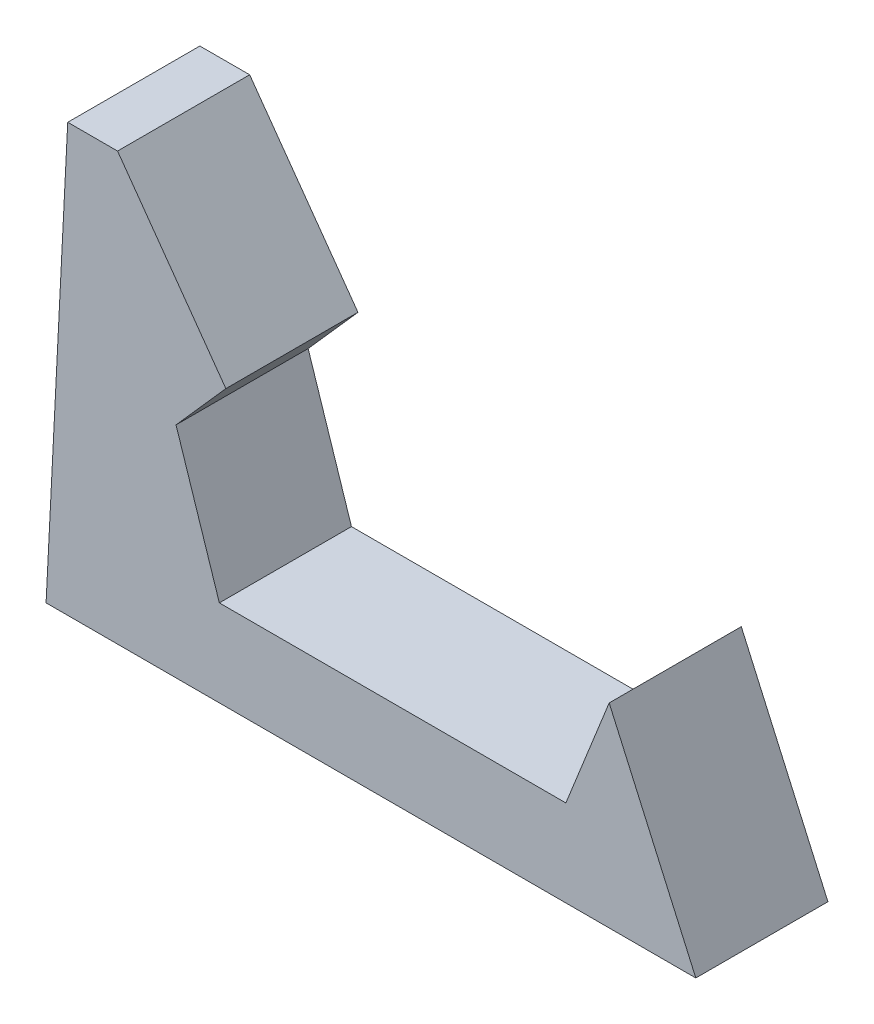
ISO-10303-21;
HEADER;
FILE_DESCRIPTION(('STEP AP214'),'2;1');
FILE_NAME('part.step','',(''),(''),'','','');
FILE_SCHEMA(('AUTOMOTIVE_DESIGN { 1 0 10303 214 1 1 1 1 }'));
ENDSEC;
DATA;
#1=APPLICATION_CONTEXT('core data for automotive mechanical design processes');
#2=APPLICATION_PROTOCOL_DEFINITION('international standard','automotive_design',2000,#1);
#3=PRODUCT_CONTEXT('',#1,'mechanical');
#4=PRODUCT('Part','Part','',(#3));
#5=PRODUCT_RELATED_PRODUCT_CATEGORY('part','',(#4));
#6=PRODUCT_DEFINITION_FORMATION('','',#4);
#7=PRODUCT_DEFINITION_CONTEXT('part definition',#1,'design');
#8=PRODUCT_DEFINITION('design','',#6,#7);
#9=PRODUCT_DEFINITION_SHAPE('','',#8);
#10=(LENGTH_UNIT() NAMED_UNIT(*) SI_UNIT(.MILLI.,.METRE.));
#11=(NAMED_UNIT(*) PLANE_ANGLE_UNIT() SI_UNIT($,.RADIAN.));
#12=(NAMED_UNIT(*) SI_UNIT($,.STERADIAN.) SOLID_ANGLE_UNIT());
#13=UNCERTAINTY_MEASURE_WITH_UNIT(LENGTH_MEASURE(1.E-05),#10,'distance_accuracy_value','');
#14=(GEOMETRIC_REPRESENTATION_CONTEXT(3) GLOBAL_UNCERTAINTY_ASSIGNED_CONTEXT((#13)) GLOBAL_UNIT_ASSIGNED_CONTEXT((#10,
#11,#12)) REPRESENTATION_CONTEXT('',''));
#15=CARTESIAN_POINT('',(0.,0.,0.));
#16=DIRECTION('',(0.,0.,1.));
#17=DIRECTION('',(1.,0.,0.));
#18=AXIS2_PLACEMENT_3D('',#15,#16,#17);
#19=CARTESIAN_POINT('',(-49.9020599794837,240.939839482575,30.5));
#20=DIRECTION('',(0.,-1.,0.));
#21=DIRECTION('',(0.,0.,-1.));
#22=AXIS2_PLACEMENT_3D('',#19,#20,#21);
#23=PLANE('',#22);
#24=DIRECTION('',(-1.,0.,0.));
#25=VECTOR('',#24,1.);
#26=CARTESIAN_POINT('',(-49.9020599794837,240.939839482575,0.));
#27=LINE('',#26,#25);
#28=CARTESIAN_POINT('',(-49.9020599794837,240.939839482575,0.));
#29=VERTEX_POINT('',#28);
#30=CARTESIAN_POINT('',(-61.4020599794837,240.939839482575,0.));
#31=VERTEX_POINT('',#30);
#32=EDGE_CURVE('E121',#29,#31,#27,.T.);
#33=ORIENTED_EDGE('',*,*,#32,.T.);
#34=DIRECTION('',(0.,0.,-1.));
#35=VECTOR('',#34,1.);
#36=CARTESIAN_POINT('',(-61.4020599794837,240.939839482575,30.5));
#37=LINE('',#36,#35);
#38=CARTESIAN_POINT('',(-61.4020599794837,240.939839482575,30.5));
#39=VERTEX_POINT('',#38);
#40=EDGE_CURVE('E12',#39,#31,#37,.T.);
#41=ORIENTED_EDGE('',*,*,#40,.F.);
#42=DIRECTION('',(-1.,0.,0.));
#43=VECTOR('',#42,1.);
#44=CARTESIAN_POINT('',(-49.9020599794837,240.939839482575,30.5));
#45=LINE('',#44,#43);
#46=CARTESIAN_POINT('',(-49.9020599794837,240.939839482575,30.5));
#47=VERTEX_POINT('',#46);
#48=EDGE_CURVE('E150',#47,#39,#45,.T.);
#49=ORIENTED_EDGE('',*,*,#48,.F.);
#50=DIRECTION('',(0.,0.,-1.));
#51=VECTOR('',#50,1.);
#52=CARTESIAN_POINT('',(-49.9020599794837,240.939839482575,30.5));
#53=LINE('',#52,#51);
#54=EDGE_CURVE('E134',#47,#29,#53,.T.);
#55=ORIENTED_EDGE('',*,*,#54,.T.);
#56=EDGE_LOOP('',(#33,#41,#49,#55));
#57=FACE_BOUND('',#56,.T.);
#58=ADVANCED_FACE('F47',(#57),#23,.F.);
#59=CARTESIAN_POINT('',(-61.4020599794837,240.939839482575,30.5));
#60=DIRECTION('',(0.998716488094579,-0.0506495449933201,0.));
#61=DIRECTION('',(0.0506495449933201,0.998716488094579,0.));
#62=AXIS2_PLACEMENT_3D('',#59,#60,#61);
#63=PLANE('',#62);
#64=DIRECTION('',(-0.0506495449933201,-0.998716488094579,0.));
#65=VECTOR('',#64,1.);
#66=CARTESIAN_POINT('',(-61.4020599794837,240.939839482575,0.));
#67=LINE('',#66,#65);
#68=CARTESIAN_POINT('',(-66.4020599794837,142.348974724926,0.));
#69=VERTEX_POINT('',#68);
#70=EDGE_CURVE('E117',#31,#69,#67,.T.);
#71=ORIENTED_EDGE('',*,*,#70,.T.);
#72=DIRECTION('',(0.,0.,-1.));
#73=VECTOR('',#72,1.);
#74=CARTESIAN_POINT('',(-66.4020599794837,142.348974724926,30.5));
#75=LINE('',#74,#73);
#76=CARTESIAN_POINT('',(-66.4020599794837,142.348974724926,30.5));
#77=VERTEX_POINT('',#76);
#78=EDGE_CURVE('E54',#77,#69,#75,.T.);
#79=ORIENTED_EDGE('',*,*,#78,.F.);
#80=DIRECTION('',(-0.0506495449933201,-0.998716488094579,0.));
#81=VECTOR('',#80,1.);
#82=CARTESIAN_POINT('',(-61.4020599794837,240.939839482575,30.5));
#83=LINE('',#82,#81);
#84=EDGE_CURVE('E130',#39,#77,#83,.T.);
#85=ORIENTED_EDGE('',*,*,#84,.F.);
#86=ORIENTED_EDGE('',*,*,#40,.T.);
#87=EDGE_LOOP('',(#71,#79,#85,#86));
#88=FACE_BOUND('',#87,.T.);
#89=ADVANCED_FACE('F129',(#88),#63,.F.);
#90=CARTESIAN_POINT('',(-66.4020599794837,142.348974724926,30.5));
#91=DIRECTION('',(0.,1.,0.));
#92=DIRECTION('',(-1.,0.,0.));
#93=AXIS2_PLACEMENT_3D('',#90,#91,#92);
#94=PLANE('',#93);
#95=DIRECTION('',(1.,0.,0.));
#96=VECTOR('',#95,1.);
#97=CARTESIAN_POINT('',(-66.4020599794837,142.348974724926,0.));
#98=LINE('',#97,#96);
#99=CARTESIAN_POINT('',(83.5979400205163,142.348974724926,0.));
#100=VERTEX_POINT('',#99);
#101=EDGE_CURVE('E123',#69,#100,#98,.T.);
#102=ORIENTED_EDGE('',*,*,#101,.T.);
#103=DIRECTION('',(0.,0.,-1.));
#104=VECTOR('',#103,1.);
#105=CARTESIAN_POINT('',(83.5979400205163,142.348974724926,30.5));
#106=LINE('',#105,#104);
#107=CARTESIAN_POINT('',(83.5979400205163,142.348974724926,30.5));
#108=VERTEX_POINT('',#107);
#109=EDGE_CURVE('E196',#108,#100,#106,.T.);
#110=ORIENTED_EDGE('',*,*,#109,.F.);
#111=DIRECTION('',(1.,0.,0.));
#112=VECTOR('',#111,1.);
#113=CARTESIAN_POINT('',(-66.4020599794837,142.348974724926,30.5));
#114=LINE('',#113,#112);
#115=EDGE_CURVE('E161',#77,#108,#114,.T.);
#116=ORIENTED_EDGE('',*,*,#115,.F.);
#117=ORIENTED_EDGE('',*,*,#78,.T.);
#118=EDGE_LOOP('',(#102,#110,#116,#117));
#119=FACE_BOUND('',#118,.T.);
#120=ADVANCED_FACE('F200',(#119),#94,.F.);
#121=CARTESIAN_POINT('',(83.5979400205163,142.348974724926,30.5));
#122=DIRECTION('',(-0.913811548620257,-0.406138466053448,0.));
#123=DIRECTION('',(0.406138466053448,-0.913811548620257,0.));
#124=AXIS2_PLACEMENT_3D('',#121,#122,#123);
#125=PLANE('',#124);
#126=DIRECTION('',(-0.406138466053448,0.913811548620257,0.));
#127=VECTOR('',#126,1.);
#128=CARTESIAN_POINT('',(83.5979400205163,142.348974724926,0.));
#129=LINE('',#128,#127);
#130=CARTESIAN_POINT('',(63.5979400205163,187.348974724926,0.));
#131=VERTEX_POINT('',#130);
#132=EDGE_CURVE('E138',#100,#131,#129,.T.);
#133=ORIENTED_EDGE('',*,*,#132,.T.);
#134=DIRECTION('',(0.,0.,-1.));
#135=VECTOR('',#134,1.);
#136=CARTESIAN_POINT('',(63.5979400205163,187.348974724926,30.5));
#137=LINE('',#136,#135);
#138=CARTESIAN_POINT('',(63.5979400205163,187.348974724926,30.5));
#139=VERTEX_POINT('',#138);
#140=EDGE_CURVE('E193',#139,#131,#137,.T.);
#141=ORIENTED_EDGE('',*,*,#140,.F.);
#142=DIRECTION('',(-0.406138466053448,0.913811548620257,0.));
#143=VECTOR('',#142,1.);
#144=CARTESIAN_POINT('',(83.5979400205163,142.348974724926,30.5));
#145=LINE('',#144,#143);
#146=EDGE_CURVE('E163',#108,#139,#145,.T.);
#147=ORIENTED_EDGE('',*,*,#146,.F.);
#148=ORIENTED_EDGE('',*,*,#109,.T.);
#149=EDGE_LOOP('',(#133,#141,#147,#148));
#150=FACE_BOUND('',#149,.T.);
#151=ADVANCED_FACE('F208',(#150),#125,.F.);
#152=CARTESIAN_POINT('',(63.5979400205163,187.348974724926,30.5));
#153=DIRECTION('',(0.928476690885259,-0.371390676354104,0.));
#154=DIRECTION('',(0.371390676354104,0.928476690885259,0.));
#155=AXIS2_PLACEMENT_3D('',#152,#153,#154);
#156=PLANE('',#155);
#157=DIRECTION('',(-0.371390676354104,-0.928476690885259,0.));
#158=VECTOR('',#157,1.);
#159=CARTESIAN_POINT('',(63.5979400205163,187.348974724926,0.));
#160=LINE('',#159,#158);
#161=CARTESIAN_POINT('',(53.5979400205163,162.348974724926,0.));
#162=VERTEX_POINT('',#161);
#163=EDGE_CURVE('E140',#131,#162,#160,.T.);
#164=ORIENTED_EDGE('',*,*,#163,.T.);
#165=DIRECTION('',(0.,0.,-1.));
#166=VECTOR('',#165,1.);
#167=CARTESIAN_POINT('',(53.5979400205163,162.348974724926,30.5));
#168=LINE('',#167,#166);
#169=CARTESIAN_POINT('',(53.5979400205163,162.348974724926,30.5));
#170=VERTEX_POINT('',#169);
#171=EDGE_CURVE('E190',#170,#162,#168,.T.);
#172=ORIENTED_EDGE('',*,*,#171,.F.);
#173=DIRECTION('',(-0.371390676354104,-0.928476690885259,0.));
#174=VECTOR('',#173,1.);
#175=CARTESIAN_POINT('',(63.5979400205163,187.348974724926,30.5));
#176=LINE('',#175,#174);
#177=EDGE_CURVE('E166',#139,#170,#176,.T.);
#178=ORIENTED_EDGE('',*,*,#177,.F.);
#179=ORIENTED_EDGE('',*,*,#140,.T.);
#180=EDGE_LOOP('',(#164,#172,#178,#179));
#181=FACE_BOUND('',#180,.T.);
#182=ADVANCED_FACE('F211',(#181),#156,.F.);
#183=CARTESIAN_POINT('',(53.5979400205163,162.348974724926,30.5));
#184=DIRECTION('',(0.,-1.,0.));
#185=DIRECTION('',(0.,0.,-1.));
#186=AXIS2_PLACEMENT_3D('',#183,#184,#185);
#187=PLANE('',#186);
#188=DIRECTION('',(-1.,0.,0.));
#189=VECTOR('',#188,1.);
#190=CARTESIAN_POINT('',(53.5979400205163,162.348974724926,0.));
#191=LINE('',#190,#189);
#192=CARTESIAN_POINT('',(-26.4020599794837,162.348974724926,0.));
#193=VERTEX_POINT('',#192);
#194=EDGE_CURVE('E142',#162,#193,#191,.T.);
#195=ORIENTED_EDGE('',*,*,#194,.T.);
#196=DIRECTION('',(0.,0.,-1.));
#197=VECTOR('',#196,1.);
#198=CARTESIAN_POINT('',(-26.4020599794837,162.348974724926,30.5));
#199=LINE('',#198,#197);
#200=CARTESIAN_POINT('',(-26.4020599794837,162.348974724926,30.5));
#201=VERTEX_POINT('',#200);
#202=EDGE_CURVE('E187',#201,#193,#199,.T.);
#203=ORIENTED_EDGE('',*,*,#202,.F.);
#204=DIRECTION('',(-1.,0.,0.));
#205=VECTOR('',#204,1.);
#206=CARTESIAN_POINT('',(53.5979400205163,162.348974724926,30.5));
#207=LINE('',#206,#205);
#208=EDGE_CURVE('E169',#170,#201,#207,.T.);
#209=ORIENTED_EDGE('',*,*,#208,.F.);
#210=ORIENTED_EDGE('',*,*,#171,.T.);
#211=EDGE_LOOP('',(#195,#203,#209,#210));
#212=FACE_BOUND('',#211,.T.);
#213=ADVANCED_FACE('F216',(#212),#187,.F.);
#214=CARTESIAN_POINT('',(-26.4020599794837,162.348974724926,30.5));
#215=DIRECTION('',(-0.950503213835858,-0.310714725250839,0.));
#216=DIRECTION('',(0.310714725250839,-0.950503213835859,0.));
#217=AXIS2_PLACEMENT_3D('',#214,#215,#216);
#218=PLANE('',#217);
#219=DIRECTION('',(-0.310714725250839,0.950503213835858,0.));
#220=VECTOR('',#219,1.);
#221=CARTESIAN_POINT('',(-26.4020599794837,162.348974724926,0.));
#222=LINE('',#221,#220);
#223=CARTESIAN_POINT('',(-36.4020599794837,192.939839482575,0.));
#224=VERTEX_POINT('',#223);
#225=EDGE_CURVE('E144',#193,#224,#222,.T.);
#226=ORIENTED_EDGE('',*,*,#225,.T.);
#227=DIRECTION('',(0.,0.,-1.));
#228=VECTOR('',#227,1.);
#229=CARTESIAN_POINT('',(-36.4020599794837,192.939839482575,30.5));
#230=LINE('',#229,#228);
#231=CARTESIAN_POINT('',(-36.4020599794837,192.939839482575,30.5));
#232=VERTEX_POINT('',#231);
#233=EDGE_CURVE('E184',#232,#224,#230,.T.);
#234=ORIENTED_EDGE('',*,*,#233,.F.);
#235=DIRECTION('',(-0.310714725250839,0.950503213835858,0.));
#236=VECTOR('',#235,1.);
#237=CARTESIAN_POINT('',(-26.4020599794837,162.348974724926,30.5));
#238=LINE('',#237,#236);
#239=EDGE_CURVE('E175',#201,#232,#238,.T.);
#240=ORIENTED_EDGE('',*,*,#239,.F.);
#241=ORIENTED_EDGE('',*,*,#202,.T.);
#242=EDGE_LOOP('',(#226,#234,#240,#241));
#243=FACE_BOUND('',#242,.T.);
#244=ADVANCED_FACE('F220',(#243),#218,.F.);
#245=CARTESIAN_POINT('',(-36.4020599794837,192.939839482575,30.5));
#246=DIRECTION('',(-0.748996562490381,0.662573882203029,0.));
#247=DIRECTION('',(-0.662573882203029,-0.748996562490381,0.));
#248=AXIS2_PLACEMENT_3D('',#245,#246,#247);
#249=PLANE('',#248);
#250=DIRECTION('',(0.662573882203029,0.748996562490381,0.));
#251=VECTOR('',#250,1.);
#252=CARTESIAN_POINT('',(-36.4020599794837,192.939839482575,0.));
#253=LINE('',#252,#251);
#254=CARTESIAN_POINT('',(-24.9020599794837,205.939839482575,0.));
#255=VERTEX_POINT('',#254);
#256=EDGE_CURVE('E146',#224,#255,#253,.T.);
#257=ORIENTED_EDGE('',*,*,#256,.T.);
#258=DIRECTION('',(0.,0.,-1.));
#259=VECTOR('',#258,1.);
#260=CARTESIAN_POINT('',(-24.9020599794837,205.939839482575,30.5));
#261=LINE('',#260,#259);
#262=CARTESIAN_POINT('',(-24.9020599794837,205.939839482575,30.5));
#263=VERTEX_POINT('',#262);
#264=EDGE_CURVE('E181',#263,#255,#261,.T.);
#265=ORIENTED_EDGE('',*,*,#264,.F.);
#266=DIRECTION('',(0.662573882203029,0.748996562490381,0.));
#267=VECTOR('',#266,1.);
#268=CARTESIAN_POINT('',(-36.4020599794837,192.939839482575,30.5));
#269=LINE('',#268,#267);
#270=EDGE_CURVE('E66',#232,#263,#269,.T.);
#271=ORIENTED_EDGE('',*,*,#270,.F.);
#272=ORIENTED_EDGE('',*,*,#233,.T.);
#273=EDGE_LOOP('',(#257,#265,#271,#272));
#274=FACE_BOUND('',#273,.T.);
#275=ADVANCED_FACE('F224',(#274),#249,.F.);
#276=CARTESIAN_POINT('',(-24.9020599794837,205.939839482575,30.5));
#277=DIRECTION('',(-0.813733471206735,-0.581238193719096,0.));
#278=DIRECTION('',(0.581238193719096,-0.813733471206735,0.));
#279=AXIS2_PLACEMENT_3D('',#276,#277,#278);
#280=PLANE('',#279);
#281=DIRECTION('',(-0.581238193719096,0.813733471206735,0.));
#282=VECTOR('',#281,1.);
#283=CARTESIAN_POINT('',(-24.9020599794837,205.939839482575,0.));
#284=LINE('',#283,#282);
#285=EDGE_CURVE('E148',#255,#29,#284,.T.);
#286=ORIENTED_EDGE('',*,*,#285,.T.);
#287=ORIENTED_EDGE('',*,*,#54,.F.);
#288=DIRECTION('',(-0.581238193719096,0.813733471206735,0.));
#289=VECTOR('',#288,1.);
#290=CARTESIAN_POINT('',(-24.9020599794837,205.939839482575,30.5));
#291=LINE('',#290,#289);
#292=EDGE_CURVE('E61',#263,#47,#291,.T.);
#293=ORIENTED_EDGE('',*,*,#292,.F.);
#294=ORIENTED_EDGE('',*,*,#264,.T.);
#295=EDGE_LOOP('',(#286,#287,#293,#294));
#296=FACE_BOUND('',#295,.T.);
#297=ADVANCED_FACE('F226',(#296),#280,.F.);
#298=CARTESIAN_POINT('',(-61.4020599794837,240.939839482575,30.5));
#299=DIRECTION('',(0.,0.,1.));
#300=DIRECTION('',(1.,0.,0.));
#301=AXIS2_PLACEMENT_3D('',#298,#299,#300);
#302=PLANE('',#301);
#303=ORIENTED_EDGE('',*,*,#48,.T.);
#304=ORIENTED_EDGE('',*,*,#84,.T.);
#305=ORIENTED_EDGE('',*,*,#115,.T.);
#306=ORIENTED_EDGE('',*,*,#146,.T.);
#307=ORIENTED_EDGE('',*,*,#177,.T.);
#308=ORIENTED_EDGE('',*,*,#208,.T.);
#309=ORIENTED_EDGE('',*,*,#239,.T.);
#310=ORIENTED_EDGE('',*,*,#270,.T.);
#311=ORIENTED_EDGE('',*,*,#292,.T.);
#312=EDGE_LOOP('',(#303,#304,#305,#306,#307,#308,#309,#310,#311));
#313=FACE_BOUND('',#312,.T.);
#314=ADVANCED_FACE('F203',(#313),#302,.T.);
#315=CARTESIAN_POINT('',(-61.4020599794837,240.939839482575,0.));
#316=DIRECTION('',(0.,0.,1.));
#317=DIRECTION('',(1.,0.,0.));
#318=AXIS2_PLACEMENT_3D('',#315,#316,#317);
#319=PLANE('',#318);
#320=ORIENTED_EDGE('',*,*,#32,.F.);
#321=ORIENTED_EDGE('',*,*,#285,.F.);
#322=ORIENTED_EDGE('',*,*,#256,.F.);
#323=ORIENTED_EDGE('',*,*,#225,.F.);
#324=ORIENTED_EDGE('',*,*,#194,.F.);
#325=ORIENTED_EDGE('',*,*,#163,.F.);
#326=ORIENTED_EDGE('',*,*,#132,.F.);
#327=ORIENTED_EDGE('',*,*,#101,.F.);
#328=ORIENTED_EDGE('',*,*,#70,.F.);
#329=EDGE_LOOP('',(#320,#321,#322,#323,#324,#325,#326,#327,#328));
#330=FACE_BOUND('',#329,.T.);
#331=ADVANCED_FACE('F118',(#330),#319,.F.);
#332=CLOSED_SHELL('',(#58,#89,#120,#151,#182,#213,#244,#275,#297,#314,#331));
#333=MANIFOLD_SOLID_BREP('B2',#332);
#334=ADVANCED_BREP_SHAPE_REPRESENTATION('',(#18,#333),#14);
#335=SHAPE_DEFINITION_REPRESENTATION(#9,#334);
ENDSEC;
END-ISO-10303-21;
